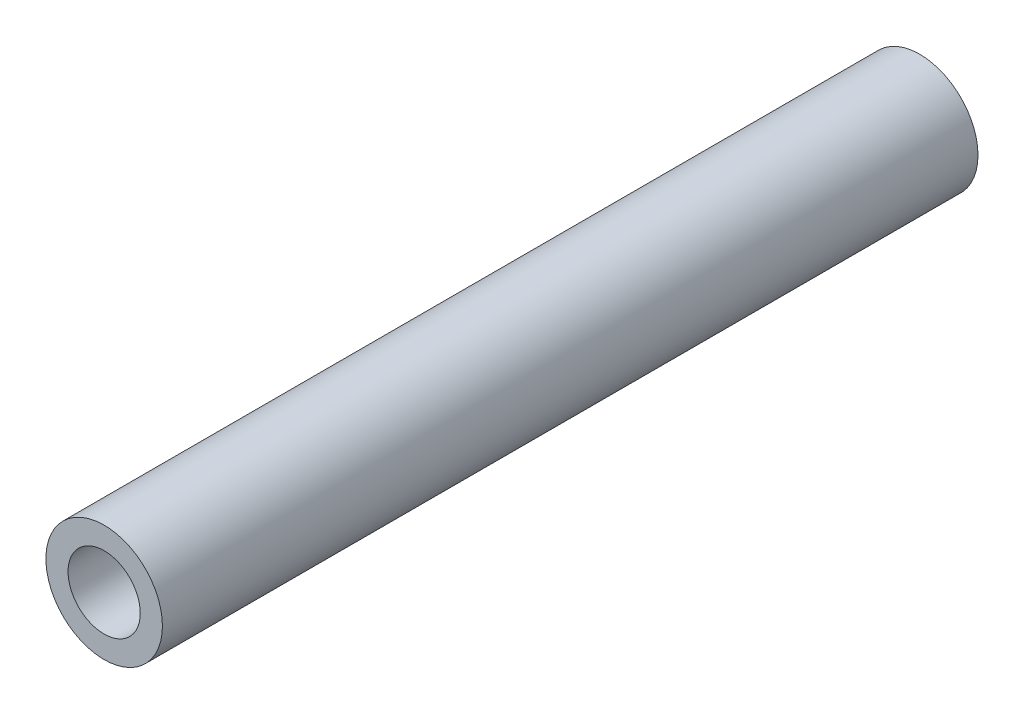
ISO-10303-21;
HEADER;
FILE_DESCRIPTION(('STEP AP214'),'2;1');
FILE_NAME('part.step','',(''),(''),'','','');
FILE_SCHEMA(('AUTOMOTIVE_DESIGN { 1 0 10303 214 1 1 1 1 }'));
ENDSEC;
DATA;
#1=APPLICATION_CONTEXT('core data for automotive mechanical design processes');
#2=APPLICATION_PROTOCOL_DEFINITION('international standard','automotive_design',2000,#1);
#3=PRODUCT_CONTEXT('',#1,'mechanical');
#4=PRODUCT('Part','Part','',(#3));
#5=PRODUCT_RELATED_PRODUCT_CATEGORY('part','',(#4));
#6=PRODUCT_DEFINITION_FORMATION('','',#4);
#7=PRODUCT_DEFINITION_CONTEXT('part definition',#1,'design');
#8=PRODUCT_DEFINITION('design','',#6,#7);
#9=PRODUCT_DEFINITION_SHAPE('','',#8);
#10=(LENGTH_UNIT() NAMED_UNIT(*) SI_UNIT(.MILLI.,.METRE.));
#11=(NAMED_UNIT(*) PLANE_ANGLE_UNIT() SI_UNIT($,.RADIAN.));
#12=(NAMED_UNIT(*) SI_UNIT($,.STERADIAN.) SOLID_ANGLE_UNIT());
#13=UNCERTAINTY_MEASURE_WITH_UNIT(LENGTH_MEASURE(1.E-05),#10,'distance_accuracy_value','');
#14=(GEOMETRIC_REPRESENTATION_CONTEXT(3) GLOBAL_UNCERTAINTY_ASSIGNED_CONTEXT((#13)) GLOBAL_UNIT_ASSIGNED_CONTEXT((#10,
#11,#12)) REPRESENTATION_CONTEXT('',''));
#15=CARTESIAN_POINT('',(0.,0.,0.));
#16=DIRECTION('',(0.,0.,1.));
#17=DIRECTION('',(1.,0.,0.));
#18=AXIS2_PLACEMENT_3D('',#15,#16,#17);
#19=CARTESIAN_POINT('',(0.,0.,35.));
#20=DIRECTION('',(0.,0.,1.));
#21=DIRECTION('',(1.,0.,0.));
#22=AXIS2_PLACEMENT_3D('',#19,#20,#21);
#23=PLANE('',#22);
#24=CARTESIAN_POINT('',(0.,0.,35.));
#25=DIRECTION('',(0.,0.,1.));
#26=DIRECTION('',(1.,0.,0.));
#27=AXIS2_PLACEMENT_3D('',#24,#25,#26);
#28=CIRCLE('',#27,2.5);
#29=CARTESIAN_POINT('',(2.5,0.,35.));
#30=VERTEX_POINT('',#29);
#31=EDGE_CURVE('E10',#30,#30,#28,.T.);
#32=ORIENTED_EDGE('',*,*,#31,.T.);
#33=EDGE_LOOP('',(#32));
#34=FACE_BOUND('',#33,.T.);
#35=CARTESIAN_POINT('',(0.,0.,35.));
#36=DIRECTION('',(0.,0.,1.));
#37=DIRECTION('',(1.,0.,0.));
#38=AXIS2_PLACEMENT_3D('',#35,#36,#37);
#39=CIRCLE('',#38,1.55);
#40=CARTESIAN_POINT('',(1.55,0.,35.));
#41=VERTEX_POINT('',#40);
#42=EDGE_CURVE('E43',#41,#41,#39,.T.);
#43=ORIENTED_EDGE('',*,*,#42,.F.);
#44=EDGE_LOOP('',(#43));
#45=FACE_BOUND('',#44,.T.);
#46=ADVANCED_FACE('F32',(#34,#45),#23,.T.);
#47=CARTESIAN_POINT('',(0.,0.,0.));
#48=DIRECTION('',(0.,0.,1.));
#49=DIRECTION('',(1.,0.,0.));
#50=AXIS2_PLACEMENT_3D('',#47,#48,#49);
#51=PLANE('',#50);
#52=CARTESIAN_POINT('',(0.,0.,0.));
#53=DIRECTION('',(0.,0.,1.));
#54=DIRECTION('',(1.,0.,0.));
#55=AXIS2_PLACEMENT_3D('',#52,#53,#54);
#56=CIRCLE('',#55,2.5);
#57=CARTESIAN_POINT('',(2.5,0.,0.));
#58=VERTEX_POINT('',#57);
#59=EDGE_CURVE('E36',#58,#58,#56,.T.);
#60=ORIENTED_EDGE('',*,*,#59,.F.);
#61=EDGE_LOOP('',(#60));
#62=FACE_BOUND('',#61,.T.);
#63=CARTESIAN_POINT('',(0.,0.,0.));
#64=DIRECTION('',(0.,0.,1.));
#65=DIRECTION('',(1.,0.,0.));
#66=AXIS2_PLACEMENT_3D('',#63,#64,#65);
#67=CIRCLE('',#66,1.55);
#68=CARTESIAN_POINT('',(1.55,0.,0.));
#69=VERTEX_POINT('',#68);
#70=EDGE_CURVE('E45',#69,#69,#67,.T.);
#71=ORIENTED_EDGE('',*,*,#70,.T.);
#72=EDGE_LOOP('',(#71));
#73=FACE_BOUND('',#72,.T.);
#74=ADVANCED_FACE('F55',(#62,#73),#51,.F.);
#75=CARTESIAN_POINT('',(0.,0.,35.));
#76=DIRECTION('',(0.,0.,-1.));
#77=DIRECTION('',(-1.,0.,0.));
#78=AXIS2_PLACEMENT_3D('',#75,#76,#77);
#79=CYLINDRICAL_SURFACE('',#78,2.5);
#80=ORIENTED_EDGE('',*,*,#31,.F.);
#81=EDGE_LOOP('',(#80));
#82=FACE_BOUND('',#81,.T.);
#83=ORIENTED_EDGE('',*,*,#59,.T.);
#84=EDGE_LOOP('',(#83));
#85=FACE_BOUND('',#84,.T.);
#86=ADVANCED_FACE('F34',(#82,#85),#79,.T.);
#87=CARTESIAN_POINT('',(0.,0.,35.));
#88=DIRECTION('',(0.,0.,-1.));
#89=DIRECTION('',(-1.,0.,0.));
#90=AXIS2_PLACEMENT_3D('',#87,#88,#89);
#91=CYLINDRICAL_SURFACE('',#90,1.55);
#92=ORIENTED_EDGE('',*,*,#42,.T.);
#93=EDGE_LOOP('',(#92));
#94=FACE_BOUND('',#93,.T.);
#95=ORIENTED_EDGE('',*,*,#70,.F.);
#96=EDGE_LOOP('',(#95));
#97=FACE_BOUND('',#96,.T.);
#98=ADVANCED_FACE('F51',(#94,#97),#91,.F.);
#99=CLOSED_SHELL('',(#46,#74,#86,#98));
#100=MANIFOLD_SOLID_BREP('B2',#99);
#101=ADVANCED_BREP_SHAPE_REPRESENTATION('',(#18,#100),#14);
#102=SHAPE_DEFINITION_REPRESENTATION(#9,#101);
ENDSEC;
END-ISO-10303-21;
